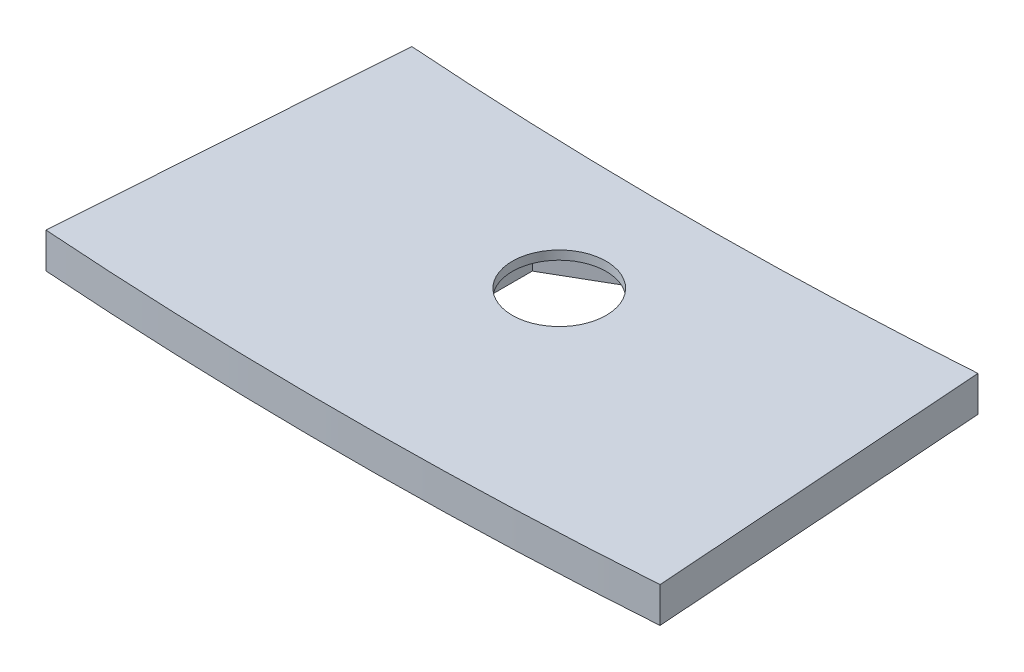
ISO-10303-21;
HEADER;
FILE_DESCRIPTION(('STEP AP214'),'2;1');
FILE_NAME('part.step','',(''),(''),'','','');
FILE_SCHEMA(('AUTOMOTIVE_DESIGN { 1 0 10303 214 1 1 1 1 }'));
ENDSEC;
DATA;
#1=APPLICATION_CONTEXT('core data for automotive mechanical design processes');
#2=APPLICATION_PROTOCOL_DEFINITION('international standard','automotive_design',2000,#1);
#3=PRODUCT_CONTEXT('',#1,'mechanical');
#4=PRODUCT('Part','Part','',(#3));
#5=PRODUCT_RELATED_PRODUCT_CATEGORY('part','',(#4));
#6=PRODUCT_DEFINITION_FORMATION('','',#4);
#7=PRODUCT_DEFINITION_CONTEXT('part definition',#1,'design');
#8=PRODUCT_DEFINITION('design','',#6,#7);
#9=PRODUCT_DEFINITION_SHAPE('','',#8);
#10=(LENGTH_UNIT() NAMED_UNIT(*) SI_UNIT(.MILLI.,.METRE.));
#11=(NAMED_UNIT(*) PLANE_ANGLE_UNIT() SI_UNIT($,.RADIAN.));
#12=(NAMED_UNIT(*) SI_UNIT($,.STERADIAN.) SOLID_ANGLE_UNIT());
#13=UNCERTAINTY_MEASURE_WITH_UNIT(LENGTH_MEASURE(1.E-05),#10,'distance_accuracy_value','');
#14=(GEOMETRIC_REPRESENTATION_CONTEXT(3) GLOBAL_UNCERTAINTY_ASSIGNED_CONTEXT((#13)) GLOBAL_UNIT_ASSIGNED_CONTEXT((#10,
#11,#12)) REPRESENTATION_CONTEXT('',''));
#15=CARTESIAN_POINT('',(0.,0.,0.));
#16=DIRECTION('',(0.,0.,1.));
#17=DIRECTION('',(1.,0.,0.));
#18=AXIS2_PLACEMENT_3D('',#15,#16,#17);
#19=CARTESIAN_POINT('',(-4.35114280077257E-12,0.,3.66381025475767E-12));
#20=DIRECTION('',(0.,-1.,0.));
#21=DIRECTION('',(0.,0.,-1.));
#22=AXIS2_PLACEMENT_3D('',#19,#20,#21);
#23=PLANE('',#22);
#24=CARTESIAN_POINT('',(-4.35114280077257E-12,0.,3.66381025475767E-12));
#25=DIRECTION('',(0.,-1.,0.));
#26=DIRECTION('',(0.,0.,-1.));
#27=AXIS2_PLACEMENT_3D('',#24,#25,#26);
#28=CIRCLE('',#27,229.15);
#29=CARTESIAN_POINT('',(15.9846959584666,0.,228.591802117042));
#30=VERTEX_POINT('',#29);
#31=CARTESIAN_POINT('',(-15.9846959584666,0.,228.591802117042));
#32=VERTEX_POINT('',#31);
#33=EDGE_CURVE('E151',#30,#32,#28,.T.);
#34=ORIENTED_EDGE('',*,*,#33,.F.);
#35=DIRECTION('',(-0.0697564737441094,0.,-0.997564050259825));
#36=VECTOR('',#35,1.);
#37=CARTESIAN_POINT('',(15.9846959584666,0.,228.591802117042));
#38=LINE('',#37,#36);
#39=CARTESIAN_POINT('',(17.3344837254152,0.,247.894666489571));
#40=VERTEX_POINT('',#39);
#41=EDGE_CURVE('E79',#40,#30,#38,.T.);
#42=ORIENTED_EDGE('',*,*,#41,.F.);
#43=CARTESIAN_POINT('',(-4.6074255521944E-12,0.,0.));
#44=DIRECTION('',(0.,1.,0.));
#45=DIRECTION('',(0.,0.,-1.));
#46=AXIS2_PLACEMENT_3D('',#43,#44,#45);
#47=CIRCLE('',#46,248.500000000005);
#48=CARTESIAN_POINT('',(-17.3344837254152,0.,247.894666489571));
#49=VERTEX_POINT('',#48);
#50=EDGE_CURVE('E163',#49,#40,#47,.T.);
#51=ORIENTED_EDGE('',*,*,#50,.F.);
#52=DIRECTION('',(-0.0697564737441075,0.,0.997564050259826));
#53=VECTOR('',#52,1.);
#54=CARTESIAN_POINT('',(-15.9846959584666,0.,228.591802117042));
#55=LINE('',#54,#53);
#56=EDGE_CURVE('E161',#32,#49,#55,.T.);
#57=ORIENTED_EDGE('',*,*,#56,.F.);
#58=EDGE_LOOP('',(#34,#42,#51,#57));
#59=FACE_BOUND('',#58,.T.);
#60=DIRECTION('',(0.,0.,1.));
#61=VECTOR('',#60,1.);
#62=CARTESIAN_POINT('',(-3.60000000000005,0.,234.171539030917));
#63=LINE('',#62,#61);
#64=CARTESIAN_POINT('',(-3.60000000000005,0.,234.171539030917));
#65=VERTEX_POINT('',#64);
#66=CARTESIAN_POINT('',(-3.60000000000005,0.,238.328460969083));
#67=VERTEX_POINT('',#66);
#68=EDGE_CURVE('E136',#65,#67,#63,.T.);
#69=ORIENTED_EDGE('',*,*,#68,.T.);
#70=DIRECTION('',(0.866025403784441,0.,0.499999999999996));
#71=VECTOR('',#70,1.);
#72=CARTESIAN_POINT('',(-3.60000000000005,0.,238.328460969083));
#73=LINE('',#72,#71);
#74=CARTESIAN_POINT('',(0.,0.,240.406921938165));
#75=VERTEX_POINT('',#74);
#76=EDGE_CURVE('E49',#67,#75,#73,.T.);
#77=ORIENTED_EDGE('',*,*,#76,.T.);
#78=DIRECTION('',(0.866025403784441,0.,-0.499999999999997));
#79=VECTOR('',#78,1.);
#80=CARTESIAN_POINT('',(0.,0.,240.406921938165));
#81=LINE('',#80,#79);
#82=CARTESIAN_POINT('',(3.60000000000002,0.,238.328460969083));
#83=VERTEX_POINT('',#82);
#84=EDGE_CURVE('E140',#75,#83,#81,.T.);
#85=ORIENTED_EDGE('',*,*,#84,.T.);
#86=DIRECTION('',(0.,0.,-1.));
#87=VECTOR('',#86,1.);
#88=CARTESIAN_POINT('',(3.60000000000002,0.,238.328460969083));
#89=LINE('',#88,#87);
#90=CARTESIAN_POINT('',(3.60000000000002,0.,234.171539030917));
#91=VERTEX_POINT('',#90);
#92=EDGE_CURVE('E323',#83,#91,#89,.T.);
#93=ORIENTED_EDGE('',*,*,#92,.T.);
#94=DIRECTION('',(-0.866025403784438,0.,-0.500000000000002));
#95=VECTOR('',#94,1.);
#96=CARTESIAN_POINT('',(3.60000000000002,0.,234.171539030917));
#97=LINE('',#96,#95);
#98=CARTESIAN_POINT('',(0.,0.,232.093078061835));
#99=VERTEX_POINT('',#98);
#100=EDGE_CURVE('E320',#91,#99,#97,.T.);
#101=ORIENTED_EDGE('',*,*,#100,.T.);
#102=DIRECTION('',(-0.866025403784438,0.,0.500000000000001));
#103=VECTOR('',#102,1.);
#104=CARTESIAN_POINT('',(0.,0.,232.093078061835));
#105=LINE('',#104,#103);
#106=EDGE_CURVE('E314',#99,#65,#105,.T.);
#107=ORIENTED_EDGE('',*,*,#106,.T.);
#108=EDGE_LOOP('',(#69,#77,#85,#93,#101,#107));
#109=FACE_BOUND('',#108,.T.);
#110=ADVANCED_FACE('F33',(#59,#109),#23,.T.);
#111=CARTESIAN_POINT('',(-4.35114280077257E-12,2.,3.66381025475767E-12));
#112=DIRECTION('',(0.,-1.,0.));
#113=DIRECTION('',(0.,0.,-1.));
#114=AXIS2_PLACEMENT_3D('',#111,#112,#113);
#115=PLANE('',#114);
#116=CARTESIAN_POINT('',(-4.35114280077257E-12,2.,3.66381025475767E-12));
#117=DIRECTION('',(0.,-1.,0.));
#118=DIRECTION('',(0.,0.,-1.));
#119=AXIS2_PLACEMENT_3D('',#116,#117,#118);
#120=CIRCLE('',#119,229.15);
#121=CARTESIAN_POINT('',(15.9846959584666,2.,228.591802117042));
#122=VERTEX_POINT('',#121);
#123=CARTESIAN_POINT('',(-15.9846959584666,2.,228.591802117042));
#124=VERTEX_POINT('',#123);
#125=EDGE_CURVE('E152',#122,#124,#120,.T.);
#126=ORIENTED_EDGE('',*,*,#125,.T.);
#127=DIRECTION('',(-0.0697564737441075,0.,0.997564050259826));
#128=VECTOR('',#127,1.);
#129=CARTESIAN_POINT('',(-15.9846959584666,2.,228.591802117042));
#130=LINE('',#129,#128);
#131=CARTESIAN_POINT('',(-17.3344837254152,2.,247.894666489571));
#132=VERTEX_POINT('',#131);
#133=EDGE_CURVE('E86',#124,#132,#130,.T.);
#134=ORIENTED_EDGE('',*,*,#133,.T.);
#135=CARTESIAN_POINT('',(-4.6074255521944E-12,2.,0.));
#136=DIRECTION('',(0.,1.,0.));
#137=DIRECTION('',(0.,0.,-1.));
#138=AXIS2_PLACEMENT_3D('',#135,#136,#137);
#139=CIRCLE('',#138,248.500000000005);
#140=CARTESIAN_POINT('',(17.3344837254152,2.,247.894666489571));
#141=VERTEX_POINT('',#140);
#142=EDGE_CURVE('E155',#132,#141,#139,.T.);
#143=ORIENTED_EDGE('',*,*,#142,.T.);
#144=DIRECTION('',(-0.0697564737441094,0.,-0.997564050259825));
#145=VECTOR('',#144,1.);
#146=CARTESIAN_POINT('',(15.9846959584666,2.,228.591802117042));
#147=LINE('',#146,#145);
#148=EDGE_CURVE('E58',#141,#122,#147,.T.);
#149=ORIENTED_EDGE('',*,*,#148,.T.);
#150=EDGE_LOOP('',(#126,#134,#143,#149));
#151=FACE_BOUND('',#150,.T.);
#152=CARTESIAN_POINT('',(0.,2.,236.25));
#153=DIRECTION('',(0.,1.,0.));
#154=DIRECTION('',(0.,0.,1.));
#155=AXIS2_PLACEMENT_3D('',#152,#153,#154);
#156=CIRCLE('',#155,2.65);
#157=CARTESIAN_POINT('',(0.,2.,238.9));
#158=VERTEX_POINT('',#157);
#159=EDGE_CURVE('E144',#158,#158,#156,.T.);
#160=ORIENTED_EDGE('',*,*,#159,.F.);
#161=EDGE_LOOP('',(#160));
#162=FACE_BOUND('',#161,.T.);
#163=ADVANCED_FACE('F195',(#151,#162),#115,.F.);
#164=CARTESIAN_POINT('',(-4.35114280077257E-12,2.,3.66381025475767E-12));
#165=DIRECTION('',(0.,-1.,0.));
#166=DIRECTION('',(0.,0.,-1.));
#167=AXIS2_PLACEMENT_3D('',#164,#165,#166);
#168=CYLINDRICAL_SURFACE('',#167,229.15);
#169=ORIENTED_EDGE('',*,*,#33,.T.);
#170=DIRECTION('',(0.,-1.,0.));
#171=VECTOR('',#170,1.);
#172=CARTESIAN_POINT('',(-15.9846959584666,2.,228.591802117042));
#173=LINE('',#172,#171);
#174=EDGE_CURVE('E11',#124,#32,#173,.T.);
#175=ORIENTED_EDGE('',*,*,#174,.F.);
#176=ORIENTED_EDGE('',*,*,#125,.F.);
#177=DIRECTION('',(0.,-1.,0.));
#178=VECTOR('',#177,1.);
#179=CARTESIAN_POINT('',(15.9846959584666,2.,228.591802117042));
#180=LINE('',#179,#178);
#181=EDGE_CURVE('E158',#122,#30,#180,.T.);
#182=ORIENTED_EDGE('',*,*,#181,.T.);
#183=EDGE_LOOP('',(#169,#175,#176,#182));
#184=FACE_BOUND('',#183,.T.);
#185=ADVANCED_FACE('F35',(#184),#168,.F.);
#186=CARTESIAN_POINT('',(-15.9846959584666,2.,228.591802117042));
#187=DIRECTION('',(0.997564050259826,0.,0.0697564737441075));
#188=DIRECTION('',(0.0697564737441075,0.,-0.997564050259826));
#189=AXIS2_PLACEMENT_3D('',#186,#187,#188);
#190=PLANE('',#189);
#191=ORIENTED_EDGE('',*,*,#56,.T.);
#192=DIRECTION('',(0.,-1.,0.));
#193=VECTOR('',#192,1.);
#194=CARTESIAN_POINT('',(-17.3344837254152,2.,247.894666489571));
#195=LINE('',#194,#193);
#196=EDGE_CURVE('E42',#132,#49,#195,.T.);
#197=ORIENTED_EDGE('',*,*,#196,.F.);
#198=ORIENTED_EDGE('',*,*,#133,.F.);
#199=ORIENTED_EDGE('',*,*,#174,.T.);
#200=EDGE_LOOP('',(#191,#197,#198,#199));
#201=FACE_BOUND('',#200,.T.);
#202=ADVANCED_FACE('F191',(#201),#190,.F.);
#203=CARTESIAN_POINT('',(-4.6074255521944E-12,2.,0.));
#204=DIRECTION('',(0.,-1.,0.));
#205=DIRECTION('',(0.,0.,-1.));
#206=AXIS2_PLACEMENT_3D('',#203,#204,#205);
#207=CYLINDRICAL_SURFACE('',#206,248.500000000005);
#208=ORIENTED_EDGE('',*,*,#50,.T.);
#209=DIRECTION('',(0.,-1.,0.));
#210=VECTOR('',#209,1.);
#211=CARTESIAN_POINT('',(17.3344837254152,2.,247.894666489571));
#212=LINE('',#211,#210);
#213=EDGE_CURVE('E167',#141,#40,#212,.T.);
#214=ORIENTED_EDGE('',*,*,#213,.F.);
#215=ORIENTED_EDGE('',*,*,#142,.F.);
#216=ORIENTED_EDGE('',*,*,#196,.T.);
#217=EDGE_LOOP('',(#208,#214,#215,#216));
#218=FACE_BOUND('',#217,.T.);
#219=ADVANCED_FACE('F173',(#218),#207,.T.);
#220=CARTESIAN_POINT('',(15.9846959584666,2.,228.591802117042));
#221=DIRECTION('',(-0.997564050259825,0.,0.0697564737441094));
#222=DIRECTION('',(0.0697564737441094,0.,0.997564050259825));
#223=AXIS2_PLACEMENT_3D('',#220,#221,#222);
#224=PLANE('',#223);
#225=ORIENTED_EDGE('',*,*,#41,.T.);
#226=ORIENTED_EDGE('',*,*,#181,.F.);
#227=ORIENTED_EDGE('',*,*,#148,.F.);
#228=ORIENTED_EDGE('',*,*,#213,.T.);
#229=EDGE_LOOP('',(#225,#226,#227,#228));
#230=FACE_BOUND('',#229,.T.);
#231=ADVANCED_FACE('F181',(#230),#224,.F.);
#232=CARTESIAN_POINT('',(0.,2.,236.25));
#233=DIRECTION('',(0.,-1.,0.));
#234=DIRECTION('',(0.,0.,-1.));
#235=AXIS2_PLACEMENT_3D('',#232,#233,#234);
#236=CYLINDRICAL_SURFACE('',#235,2.65);
#237=CARTESIAN_POINT('',(0.,1.5,236.25));
#238=DIRECTION('',(0.,1.,0.));
#239=DIRECTION('',(0.,0.,1.));
#240=AXIS2_PLACEMENT_3D('',#237,#238,#239);
#241=CIRCLE('',#240,2.65);
#242=CARTESIAN_POINT('',(0.,1.5,238.9));
#243=VERTEX_POINT('',#242);
#244=EDGE_CURVE('E37',#243,#243,#241,.T.);
#245=ORIENTED_EDGE('',*,*,#244,.F.);
#246=EDGE_LOOP('',(#245));
#247=FACE_BOUND('',#246,.T.);
#248=ORIENTED_EDGE('',*,*,#159,.T.);
#249=EDGE_LOOP('',(#248));
#250=FACE_BOUND('',#249,.T.);
#251=ADVANCED_FACE('F183',(#247,#250),#236,.F.);
#252=CARTESIAN_POINT('',(-3.60000000000005,1.5,238.328460969083));
#253=DIRECTION('',(0.499999999999996,0.,-0.866025403784441));
#254=DIRECTION('',(-0.866025403784441,0.,-0.499999999999996));
#255=AXIS2_PLACEMENT_3D('',#252,#253,#254);
#256=PLANE('',#255);
#257=ORIENTED_EDGE('',*,*,#76,.F.);
#258=DIRECTION('',(0.,-1.,0.));
#259=VECTOR('',#258,1.);
#260=CARTESIAN_POINT('',(-3.60000000000005,1.5,238.328460969083));
#261=LINE('',#260,#259);
#262=CARTESIAN_POINT('',(-3.60000000000005,1.5,238.328460969083));
#263=VERTEX_POINT('',#262);
#264=EDGE_CURVE('E135',#263,#67,#261,.T.);
#265=ORIENTED_EDGE('',*,*,#264,.F.);
#266=DIRECTION('',(0.866025403784441,0.,0.499999999999996));
#267=VECTOR('',#266,1.);
#268=CARTESIAN_POINT('',(-3.60000000000005,1.5,238.328460969083));
#269=LINE('',#268,#267);
#270=CARTESIAN_POINT('',(0.,1.5,240.406921938165));
#271=VERTEX_POINT('',#270);
#272=EDGE_CURVE('E126',#263,#271,#269,.T.);
#273=ORIENTED_EDGE('',*,*,#272,.T.);
#274=DIRECTION('',(0.,-1.,0.));
#275=VECTOR('',#274,1.);
#276=CARTESIAN_POINT('',(0.,1.5,240.406921938165));
#277=LINE('',#276,#275);
#278=EDGE_CURVE('E134',#271,#75,#277,.T.);
#279=ORIENTED_EDGE('',*,*,#278,.T.);
#280=EDGE_LOOP('',(#257,#265,#273,#279));
#281=FACE_BOUND('',#280,.T.);
#282=ADVANCED_FACE('F133',(#281),#256,.T.);
#283=CARTESIAN_POINT('',(0.,1.5,240.406921938165));
#284=DIRECTION('',(-0.499999999999997,0.,-0.86602540378444));
#285=DIRECTION('',(-0.866025403784441,0.,0.499999999999997));
#286=AXIS2_PLACEMENT_3D('',#283,#284,#285);
#287=PLANE('',#286);
#288=ORIENTED_EDGE('',*,*,#84,.F.);
#289=ORIENTED_EDGE('',*,*,#278,.F.);
#290=DIRECTION('',(0.866025403784441,0.,-0.499999999999997));
#291=VECTOR('',#290,1.);
#292=CARTESIAN_POINT('',(0.,1.5,240.406921938165));
#293=LINE('',#292,#291);
#294=CARTESIAN_POINT('',(3.60000000000002,1.5,238.328460969083));
#295=VERTEX_POINT('',#294);
#296=EDGE_CURVE('E122',#271,#295,#293,.T.);
#297=ORIENTED_EDGE('',*,*,#296,.T.);
#298=DIRECTION('',(0.,-1.,0.));
#299=VECTOR('',#298,1.);
#300=CARTESIAN_POINT('',(3.60000000000002,1.5,238.328460969083));
#301=LINE('',#300,#299);
#302=EDGE_CURVE('E141',#295,#83,#301,.T.);
#303=ORIENTED_EDGE('',*,*,#302,.T.);
#304=EDGE_LOOP('',(#288,#289,#297,#303));
#305=FACE_BOUND('',#304,.T.);
#306=ADVANCED_FACE('F138',(#305),#287,.T.);
#307=CARTESIAN_POINT('',(3.60000000000002,1.5,238.328460969083));
#308=DIRECTION('',(-1.,0.,0.));
#309=DIRECTION('',(0.,0.,1.));
#310=AXIS2_PLACEMENT_3D('',#307,#308,#309);
#311=PLANE('',#310);
#312=ORIENTED_EDGE('',*,*,#92,.F.);
#313=ORIENTED_EDGE('',*,*,#302,.F.);
#314=DIRECTION('',(0.,0.,-1.));
#315=VECTOR('',#314,1.);
#316=CARTESIAN_POINT('',(3.60000000000002,1.5,238.328460969083));
#317=LINE('',#316,#315);
#318=CARTESIAN_POINT('',(3.60000000000002,1.5,234.171539030917));
#319=VERTEX_POINT('',#318);
#320=EDGE_CURVE('E128',#295,#319,#317,.T.);
#321=ORIENTED_EDGE('',*,*,#320,.T.);
#322=DIRECTION('',(0.,-1.,0.));
#323=VECTOR('',#322,1.);
#324=CARTESIAN_POINT('',(3.60000000000002,1.5,234.171539030917));
#325=LINE('',#324,#323);
#326=EDGE_CURVE('E145',#319,#91,#325,.T.);
#327=ORIENTED_EDGE('',*,*,#326,.T.);
#328=EDGE_LOOP('',(#312,#313,#321,#327));
#329=FACE_BOUND('',#328,.T.);
#330=ADVANCED_FACE('F205',(#329),#311,.T.);
#331=CARTESIAN_POINT('',(3.60000000000002,1.5,234.171539030917));
#332=DIRECTION('',(-0.500000000000002,0.,0.866025403784438));
#333=DIRECTION('',(0.866025403784438,0.,0.500000000000002));
#334=AXIS2_PLACEMENT_3D('',#331,#332,#333);
#335=PLANE('',#334);
#336=ORIENTED_EDGE('',*,*,#100,.F.);
#337=ORIENTED_EDGE('',*,*,#326,.F.);
#338=DIRECTION('',(-0.866025403784438,0.,-0.500000000000002));
#339=VECTOR('',#338,1.);
#340=CARTESIAN_POINT('',(3.60000000000002,1.5,234.171539030917));
#341=LINE('',#340,#339);
#342=CARTESIAN_POINT('',(0.,1.5,232.093078061835));
#343=VERTEX_POINT('',#342);
#344=EDGE_CURVE('E339',#319,#343,#341,.T.);
#345=ORIENTED_EDGE('',*,*,#344,.T.);
#346=DIRECTION('',(0.,-1.,0.));
#347=VECTOR('',#346,1.);
#348=CARTESIAN_POINT('',(0.,1.5,232.093078061835));
#349=LINE('',#348,#347);
#350=EDGE_CURVE('E330',#343,#99,#349,.T.);
#351=ORIENTED_EDGE('',*,*,#350,.T.);
#352=EDGE_LOOP('',(#336,#337,#345,#351));
#353=FACE_BOUND('',#352,.T.);
#354=ADVANCED_FACE('F208',(#353),#335,.T.);
#355=CARTESIAN_POINT('',(0.,1.5,232.093078061835));
#356=DIRECTION('',(0.500000000000001,0.,0.866025403784438));
#357=DIRECTION('',(0.866025403784438,0.,-0.500000000000001));
#358=AXIS2_PLACEMENT_3D('',#355,#356,#357);
#359=PLANE('',#358);
#360=ORIENTED_EDGE('',*,*,#106,.F.);
#361=ORIENTED_EDGE('',*,*,#350,.F.);
#362=DIRECTION('',(-0.866025403784438,0.,0.500000000000001));
#363=VECTOR('',#362,1.);
#364=CARTESIAN_POINT('',(0.,1.5,232.093078061835));
#365=LINE('',#364,#363);
#366=CARTESIAN_POINT('',(-3.60000000000005,1.5,234.171539030917));
#367=VERTEX_POINT('',#366);
#368=EDGE_CURVE('E337',#343,#367,#365,.T.);
#369=ORIENTED_EDGE('',*,*,#368,.T.);
#370=DIRECTION('',(0.,-1.,0.));
#371=VECTOR('',#370,1.);
#372=CARTESIAN_POINT('',(-3.60000000000005,1.5,234.171539030917));
#373=LINE('',#372,#371);
#374=EDGE_CURVE('E313',#367,#65,#373,.T.);
#375=ORIENTED_EDGE('',*,*,#374,.T.);
#376=EDGE_LOOP('',(#360,#361,#369,#375));
#377=FACE_BOUND('',#376,.T.);
#378=ADVANCED_FACE('F212',(#377),#359,.T.);
#379=CARTESIAN_POINT('',(-3.60000000000005,1.5,234.171539030917));
#380=DIRECTION('',(1.,0.,0.));
#381=DIRECTION('',(0.,0.,-1.));
#382=AXIS2_PLACEMENT_3D('',#379,#380,#381);
#383=PLANE('',#382);
#384=ORIENTED_EDGE('',*,*,#68,.F.);
#385=ORIENTED_EDGE('',*,*,#374,.F.);
#386=DIRECTION('',(0.,0.,1.));
#387=VECTOR('',#386,1.);
#388=CARTESIAN_POINT('',(-3.60000000000005,1.5,234.171539030917));
#389=LINE('',#388,#387);
#390=EDGE_CURVE('E328',#367,#263,#389,.T.);
#391=ORIENTED_EDGE('',*,*,#390,.T.);
#392=ORIENTED_EDGE('',*,*,#264,.T.);
#393=EDGE_LOOP('',(#384,#385,#391,#392));
#394=FACE_BOUND('',#393,.T.);
#395=ADVANCED_FACE('F216',(#394),#383,.T.);
#396=CARTESIAN_POINT('',(0.,1.5,0.));
#397=DIRECTION('',(0.,1.,0.));
#398=DIRECTION('',(0.,0.,1.));
#399=AXIS2_PLACEMENT_3D('',#396,#397,#398);
#400=PLANE('',#399);
#401=ORIENTED_EDGE('',*,*,#244,.T.);
#402=EDGE_LOOP('',(#401));
#403=FACE_BOUND('',#402,.T.);
#404=ORIENTED_EDGE('',*,*,#272,.F.);
#405=ORIENTED_EDGE('',*,*,#390,.F.);
#406=ORIENTED_EDGE('',*,*,#368,.F.);
#407=ORIENTED_EDGE('',*,*,#344,.F.);
#408=ORIENTED_EDGE('',*,*,#320,.F.);
#409=ORIENTED_EDGE('',*,*,#296,.F.);
#410=EDGE_LOOP('',(#404,#405,#406,#407,#408,#409));
#411=FACE_BOUND('',#410,.T.);
#412=ADVANCED_FACE('F124',(#403,#411),#400,.F.);
#413=CLOSED_SHELL('',(#110,#163,#185,#202,#219,#231,#251,#282,#306,#330,#354,#378,#395,#412));
#414=MANIFOLD_SOLID_BREP('B2',#413);
#415=ADVANCED_BREP_SHAPE_REPRESENTATION('',(#18,#414),#14);
#416=SHAPE_DEFINITION_REPRESENTATION(#9,#415);
ENDSEC;
END-ISO-10303-21;
